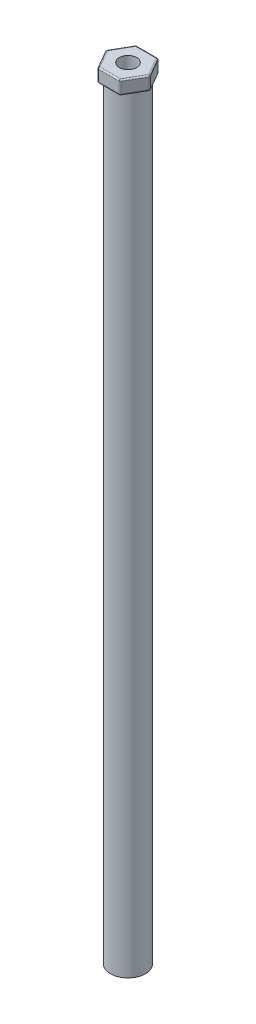
ISO-10303-21;
HEADER;
FILE_DESCRIPTION(('STEP AP214'),'2;1');
FILE_NAME('part.step','',(''),(''),'','','');
FILE_SCHEMA(('AUTOMOTIVE_DESIGN { 1 0 10303 214 1 1 1 1 }'));
ENDSEC;
DATA;
#1=APPLICATION_CONTEXT('core data for automotive mechanical design processes');
#2=APPLICATION_PROTOCOL_DEFINITION('international standard','automotive_design',2000,#1);
#3=PRODUCT_CONTEXT('',#1,'mechanical');
#4=PRODUCT('Part','Part','',(#3));
#5=PRODUCT_RELATED_PRODUCT_CATEGORY('part','',(#4));
#6=PRODUCT_DEFINITION_FORMATION('','',#4);
#7=PRODUCT_DEFINITION_CONTEXT('part definition',#1,'design');
#8=PRODUCT_DEFINITION('design','',#6,#7);
#9=PRODUCT_DEFINITION_SHAPE('','',#8);
#10=(LENGTH_UNIT() NAMED_UNIT(*) SI_UNIT(.MILLI.,.METRE.));
#11=(NAMED_UNIT(*) PLANE_ANGLE_UNIT() SI_UNIT($,.RADIAN.));
#12=(NAMED_UNIT(*) SI_UNIT($,.STERADIAN.) SOLID_ANGLE_UNIT());
#13=UNCERTAINTY_MEASURE_WITH_UNIT(LENGTH_MEASURE(1.E-05),#10,'distance_accuracy_value','');
#14=(GEOMETRIC_REPRESENTATION_CONTEXT(3) GLOBAL_UNCERTAINTY_ASSIGNED_CONTEXT((#13)) GLOBAL_UNIT_ASSIGNED_CONTEXT((#10,
#11,#12)) REPRESENTATION_CONTEXT('',''));
#15=CARTESIAN_POINT('',(0.,0.,0.));
#16=DIRECTION('',(0.,0.,1.));
#17=DIRECTION('',(1.,0.,0.));
#18=AXIS2_PLACEMENT_3D('',#15,#16,#17);
#19=CARTESIAN_POINT('',(0.,0.,0.));
#20=DIRECTION('',(0.,1.,0.));
#21=DIRECTION('',(0.,0.,1.));
#22=AXIS2_PLACEMENT_3D('',#19,#20,#21);
#23=PLANE('',#22);
#24=CARTESIAN_POINT('',(0.,0.,0.));
#25=DIRECTION('',(0.,1.,0.));
#26=DIRECTION('',(0.,0.,1.));
#27=AXIS2_PLACEMENT_3D('',#24,#25,#26);
#28=CIRCLE('',#27,6.35);
#29=CARTESIAN_POINT('',(0.,0.,6.35));
#30=VERTEX_POINT('',#29);
#31=EDGE_CURVE('E286',#30,#30,#28,.T.);
#32=ORIENTED_EDGE('',*,*,#31,.F.);
#33=EDGE_LOOP('',(#32));
#34=FACE_BOUND('',#33,.T.);
#35=CARTESIAN_POINT('',(0.,0.,0.));
#36=DIRECTION('',(0.,1.,0.));
#37=DIRECTION('',(0.,0.,1.));
#38=AXIS2_PLACEMENT_3D('',#35,#36,#37);
#39=CIRCLE('',#38,3.175);
#40=CARTESIAN_POINT('',(0.,0.,3.175));
#41=VERTEX_POINT('',#40);
#42=EDGE_CURVE('E281',#41,#41,#39,.T.);
#43=ORIENTED_EDGE('',*,*,#42,.T.);
#44=EDGE_LOOP('',(#43));
#45=FACE_BOUND('',#44,.T.);
#46=ADVANCED_FACE('F36',(#34,#45),#23,.F.);
#47=CARTESIAN_POINT('',(0.,279.4,0.));
#48=DIRECTION('',(0.,-1.,0.));
#49=DIRECTION('',(0.,0.,-1.));
#50=AXIS2_PLACEMENT_3D('',#47,#48,#49);
#51=CYLINDRICAL_SURFACE('',#50,6.35);
#52=CARTESIAN_POINT('',(0.,279.4,0.));
#53=DIRECTION('',(0.,1.,0.));
#54=DIRECTION('',(0.,0.,1.));
#55=AXIS2_PLACEMENT_3D('',#52,#53,#54);
#56=CIRCLE('',#55,6.35);
#57=CARTESIAN_POINT('',(0.,279.4,6.35));
#58=VERTEX_POINT('',#57);
#59=EDGE_CURVE('E182',#58,#58,#56,.T.);
#60=ORIENTED_EDGE('',*,*,#59,.F.);
#61=EDGE_LOOP('',(#60));
#62=FACE_BOUND('',#61,.T.);
#63=ORIENTED_EDGE('',*,*,#31,.T.);
#64=EDGE_LOOP('',(#63));
#65=FACE_BOUND('',#64,.T.);
#66=ADVANCED_FACE('F442',(#62,#65),#51,.T.);
#67=CARTESIAN_POINT('',(0.,279.4,0.));
#68=DIRECTION('',(0.,-1.,0.));
#69=DIRECTION('',(0.,0.,-1.));
#70=AXIS2_PLACEMENT_3D('',#67,#68,#69);
#71=CYLINDRICAL_SURFACE('',#70,3.175);
#72=ORIENTED_EDGE('',*,*,#42,.F.);
#73=EDGE_LOOP('',(#72));
#74=FACE_BOUND('',#73,.T.);
#75=CARTESIAN_POINT('',(0.,284.4,0.));
#76=DIRECTION('',(0.,1.,0.));
#77=DIRECTION('',(0.,0.,1.));
#78=AXIS2_PLACEMENT_3D('',#75,#76,#77);
#79=CIRCLE('',#78,3.175);
#80=CARTESIAN_POINT('',(0.,284.4,3.175));
#81=VERTEX_POINT('',#80);
#82=EDGE_CURVE('E275',#81,#81,#79,.T.);
#83=ORIENTED_EDGE('',*,*,#82,.T.);
#84=EDGE_LOOP('',(#83));
#85=FACE_BOUND('',#84,.T.);
#86=ADVANCED_FACE('F448',(#74,#85),#71,.F.);
#87=CARTESIAN_POINT('',(0.,284.4,0.));
#88=DIRECTION('',(0.,1.,0.));
#89=DIRECTION('',(0.,0.,1.));
#90=AXIS2_PLACEMENT_3D('',#87,#88,#89);
#91=PLANE('',#90);
#92=DIRECTION('',(1.,0.,0.));
#93=VECTOR('',#92,1.);
#94=CARTESIAN_POINT('',(4.03279163028954,284.4,6.485));
#95=LINE('',#94,#93);
#96=CARTESIAN_POINT('',(-3.74411649569472,284.4,6.485));
#97=VERTEX_POINT('',#96);
#98=CARTESIAN_POINT('',(3.74411649569473,284.4,6.485));
#99=VERTEX_POINT('',#98);
#100=EDGE_CURVE('E351',#97,#99,#95,.T.);
#101=ORIENTED_EDGE('',*,*,#100,.T.);
#102=DIRECTION('',(0.5,0.,-0.866025403784439));
#103=VECTOR('',#102,1.);
#104=CARTESIAN_POINT('',(7.63257055868686,284.4,-0.250000000000001));
#105=LINE('',#104,#103);
#106=CARTESIAN_POINT('',(7.48823299138945,284.4,0.));
#107=VERTEX_POINT('',#106);
#108=EDGE_CURVE('E11',#99,#107,#105,.T.);
#109=ORIENTED_EDGE('',*,*,#108,.T.);
#110=DIRECTION('',(-0.5,0.,-0.866025403784439));
#111=VECTOR('',#110,1.);
#112=CARTESIAN_POINT('',(3.59977892839731,284.4,-6.73500000000001));
#113=LINE('',#112,#111);
#114=CARTESIAN_POINT('',(3.74411649569472,284.4,-6.485));
#115=VERTEX_POINT('',#114);
#116=EDGE_CURVE('E45',#107,#115,#113,.T.);
#117=ORIENTED_EDGE('',*,*,#116,.T.);
#118=DIRECTION('',(-1.,0.,0.));
#119=VECTOR('',#118,1.);
#120=CARTESIAN_POINT('',(-4.03279163028953,284.4,-6.485));
#121=LINE('',#120,#119);
#122=CARTESIAN_POINT('',(-3.74411649569472,284.4,-6.485));
#123=VERTEX_POINT('',#122);
#124=EDGE_CURVE('E357',#115,#123,#121,.T.);
#125=ORIENTED_EDGE('',*,*,#124,.T.);
#126=DIRECTION('',(-0.5,0.,0.866025403784439));
#127=VECTOR('',#126,1.);
#128=CARTESIAN_POINT('',(-7.63257055868686,284.4,0.250000000000005));
#129=LINE('',#128,#127);
#130=CARTESIAN_POINT('',(-7.48823299138945,284.4,0.));
#131=VERTEX_POINT('',#130);
#132=EDGE_CURVE('E355',#123,#131,#129,.T.);
#133=ORIENTED_EDGE('',*,*,#132,.T.);
#134=DIRECTION('',(0.5,0.,0.866025403784438));
#135=VECTOR('',#134,1.);
#136=CARTESIAN_POINT('',(-3.59977892839732,284.4,6.735));
#137=LINE('',#136,#135);
#138=EDGE_CURVE('E353',#131,#97,#137,.T.);
#139=ORIENTED_EDGE('',*,*,#138,.T.);
#140=EDGE_LOOP('',(#101,#109,#117,#125,#133,#139));
#141=FACE_BOUND('',#140,.T.);
#142=ORIENTED_EDGE('',*,*,#82,.F.);
#143=EDGE_LOOP('',(#142));
#144=FACE_BOUND('',#143,.T.);
#145=ADVANCED_FACE('F407',(#141,#144),#91,.T.);
#146=CARTESIAN_POINT('',(0.,279.4,0.));
#147=DIRECTION('',(0.,1.,0.));
#148=DIRECTION('',(0.,0.,1.));
#149=AXIS2_PLACEMENT_3D('',#146,#147,#148);
#150=PLANE('',#149);
#151=DIRECTION('',(-0.5,0.,0.866025403784439));
#152=VECTOR('',#151,1.);
#153=CARTESIAN_POINT('',(-5.61617474354209,279.4,-3.2425));
#154=LINE('',#153,#152);
#155=CARTESIAN_POINT('',(-7.48823299138945,279.4,0.));
#156=VERTEX_POINT('',#155);
#157=CARTESIAN_POINT('',(-3.74411649569472,279.4,-6.485));
#158=VERTEX_POINT('',#157);
#159=EDGE_CURVE('E301',#156,#158,#154,.F.);
#160=ORIENTED_EDGE('',*,*,#159,.T.);
#161=DIRECTION('',(-1.,0.,0.));
#162=VECTOR('',#161,1.);
#163=CARTESIAN_POINT('',(0.,279.4,-6.485));
#164=LINE('',#163,#162);
#165=CARTESIAN_POINT('',(3.74411649569472,279.4,-6.485));
#166=VERTEX_POINT('',#165);
#167=EDGE_CURVE('E305',#158,#166,#164,.F.);
#168=ORIENTED_EDGE('',*,*,#167,.T.);
#169=DIRECTION('',(-0.5,0.,-0.866025403784439));
#170=VECTOR('',#169,1.);
#171=CARTESIAN_POINT('',(5.61617474354209,279.4,-3.2425));
#172=LINE('',#171,#170);
#173=CARTESIAN_POINT('',(7.48823299138945,279.4,0.));
#174=VERTEX_POINT('',#173);
#175=EDGE_CURVE('E303',#166,#174,#172,.F.);
#176=ORIENTED_EDGE('',*,*,#175,.T.);
#177=DIRECTION('',(0.5,0.,-0.866025403784439));
#178=VECTOR('',#177,1.);
#179=CARTESIAN_POINT('',(5.61617474354209,279.4,3.2425));
#180=LINE('',#179,#178);
#181=CARTESIAN_POINT('',(3.74411649569472,279.4,6.485));
#182=VERTEX_POINT('',#181);
#183=EDGE_CURVE('E295',#174,#182,#180,.F.);
#184=ORIENTED_EDGE('',*,*,#183,.T.);
#185=DIRECTION('',(1.,0.,0.));
#186=VECTOR('',#185,1.);
#187=CARTESIAN_POINT('',(0.,279.4,6.485));
#188=LINE('',#187,#186);
#189=CARTESIAN_POINT('',(-3.74411649569472,279.4,6.485));
#190=VERTEX_POINT('',#189);
#191=EDGE_CURVE('E297',#182,#190,#188,.F.);
#192=ORIENTED_EDGE('',*,*,#191,.T.);
#193=DIRECTION('',(0.5,0.,0.866025403784438));
#194=VECTOR('',#193,1.);
#195=CARTESIAN_POINT('',(-5.61617474354208,279.4,3.2425));
#196=LINE('',#195,#194);
#197=EDGE_CURVE('E299',#190,#156,#196,.F.);
#198=ORIENTED_EDGE('',*,*,#197,.T.);
#199=EDGE_LOOP('',(#160,#168,#176,#184,#192,#198));
#200=FACE_BOUND('',#199,.T.);
#201=ORIENTED_EDGE('',*,*,#59,.T.);
#202=EDGE_LOOP('',(#201));
#203=FACE_BOUND('',#202,.T.);
#204=ADVANCED_FACE('F385',(#200,#203),#150,.F.);
#205=CARTESIAN_POINT('',(-4.03279163028953,284.4,-6.985));
#206=DIRECTION('',(0.866025403784439,0.,0.5));
#207=DIRECTION('',(0.5,0.,-0.866025403784439));
#208=AXIS2_PLACEMENT_3D('',#205,#206,#207);
#209=PLANE('',#208);
#210=DIRECTION('',(-0.5,0.,0.866025403784439));
#211=VECTOR('',#210,1.);
#212=CARTESIAN_POINT('',(-4.03279163028953,283.9,-6.985));
#213=LINE('',#212,#211);
#214=CARTESIAN_POINT('',(-7.92124569328167,283.9,-0.249999999999997));
#215=VERTEX_POINT('',#214);
#216=CARTESIAN_POINT('',(-4.17712919758694,283.9,-6.735));
#217=VERTEX_POINT('',#216);
#218=EDGE_CURVE('E326',#215,#217,#213,.F.);
#219=ORIENTED_EDGE('',*,*,#218,.T.);
#220=DIRECTION('',(0.,-1.,0.));
#221=VECTOR('',#220,1.);
#222=CARTESIAN_POINT('',(-4.17712919758694,284.4,-6.735));
#223=LINE('',#222,#221);
#224=CARTESIAN_POINT('',(-4.17712919758694,279.9,-6.735));
#225=VERTEX_POINT('',#224);
#226=EDGE_CURVE('E194',#217,#225,#223,.T.);
#227=ORIENTED_EDGE('',*,*,#226,.T.);
#228=DIRECTION('',(-0.5,0.,0.866025403784439));
#229=VECTOR('',#228,1.);
#230=CARTESIAN_POINT('',(-4.03279163028953,279.9,-6.985));
#231=LINE('',#230,#229);
#232=CARTESIAN_POINT('',(-7.92124569328167,279.9,-0.249999999999997));
#233=VERTEX_POINT('',#232);
#234=EDGE_CURVE('E330',#225,#233,#231,.T.);
#235=ORIENTED_EDGE('',*,*,#234,.T.);
#236=DIRECTION('',(0.,-1.,0.));
#237=VECTOR('',#236,1.);
#238=CARTESIAN_POINT('',(-7.92124569328167,284.4,-0.249999999999998));
#239=LINE('',#238,#237);
#240=EDGE_CURVE('E328',#233,#215,#239,.F.);
#241=ORIENTED_EDGE('',*,*,#240,.T.);
#242=EDGE_LOOP('',(#219,#227,#235,#241));
#243=FACE_BOUND('',#242,.T.);
#244=ADVANCED_FACE('F400',(#243),#209,.F.);
#245=CARTESIAN_POINT('',(-8.06558326057907,284.4,0.));
#246=DIRECTION('',(0.866025403784438,0.,-0.5));
#247=DIRECTION('',(-0.5,0.,-0.866025403784438));
#248=AXIS2_PLACEMENT_3D('',#245,#246,#247);
#249=PLANE('',#248);
#250=DIRECTION('',(0.5,0.,0.866025403784438));
#251=VECTOR('',#250,1.);
#252=CARTESIAN_POINT('',(-8.06558326057907,283.9,0.));
#253=LINE('',#252,#251);
#254=CARTESIAN_POINT('',(-4.17712919758694,283.9,6.735));
#255=VERTEX_POINT('',#254);
#256=CARTESIAN_POINT('',(-7.92124569328167,283.9,0.250000000000003));
#257=VERTEX_POINT('',#256);
#258=EDGE_CURVE('E333',#255,#257,#253,.F.);
#259=ORIENTED_EDGE('',*,*,#258,.T.);
#260=DIRECTION('',(0.,-1.,0.));
#261=VECTOR('',#260,1.);
#262=CARTESIAN_POINT('',(-7.92124569328167,284.4,0.250000000000003));
#263=LINE('',#262,#261);
#264=CARTESIAN_POINT('',(-7.92124569328167,279.9,0.250000000000003));
#265=VERTEX_POINT('',#264);
#266=EDGE_CURVE('E339',#257,#265,#263,.T.);
#267=ORIENTED_EDGE('',*,*,#266,.T.);
#268=DIRECTION('',(0.5,0.,0.866025403784438));
#269=VECTOR('',#268,1.);
#270=CARTESIAN_POINT('',(-8.06558326057907,279.9,0.));
#271=LINE('',#270,#269);
#272=CARTESIAN_POINT('',(-4.17712919758694,279.9,6.735));
#273=VERTEX_POINT('',#272);
#274=EDGE_CURVE('E337',#265,#273,#271,.T.);
#275=ORIENTED_EDGE('',*,*,#274,.T.);
#276=DIRECTION('',(0.,-1.,0.));
#277=VECTOR('',#276,1.);
#278=CARTESIAN_POINT('',(-4.17712919758694,284.4,6.735));
#279=LINE('',#278,#277);
#280=EDGE_CURVE('E335',#273,#255,#279,.F.);
#281=ORIENTED_EDGE('',*,*,#280,.T.);
#282=EDGE_LOOP('',(#259,#267,#275,#281));
#283=FACE_BOUND('',#282,.T.);
#284=ADVANCED_FACE('F423',(#283),#249,.F.);
#285=CARTESIAN_POINT('',(-4.03279163028953,284.4,6.985));
#286=DIRECTION('',(0.,0.,-1.));
#287=DIRECTION('',(-1.,0.,0.));
#288=AXIS2_PLACEMENT_3D('',#285,#286,#287);
#289=PLANE('',#288);
#290=DIRECTION('',(1.,0.,0.));
#291=VECTOR('',#290,1.);
#292=CARTESIAN_POINT('',(-4.03279163028953,283.9,6.985));
#293=LINE('',#292,#291);
#294=CARTESIAN_POINT('',(3.74411649569472,283.9,6.985));
#295=VERTEX_POINT('',#294);
#296=CARTESIAN_POINT('',(-3.74411649569472,283.9,6.985));
#297=VERTEX_POINT('',#296);
#298=EDGE_CURVE('E342',#295,#297,#293,.F.);
#299=ORIENTED_EDGE('',*,*,#298,.T.);
#300=DIRECTION('',(0.,-1.,0.));
#301=VECTOR('',#300,1.);
#302=CARTESIAN_POINT('',(-3.74411649569472,284.4,6.985));
#303=LINE('',#302,#301);
#304=CARTESIAN_POINT('',(-3.74411649569472,279.9,6.985));
#305=VERTEX_POINT('',#304);
#306=EDGE_CURVE('E348',#297,#305,#303,.T.);
#307=ORIENTED_EDGE('',*,*,#306,.T.);
#308=DIRECTION('',(1.,0.,0.));
#309=VECTOR('',#308,1.);
#310=CARTESIAN_POINT('',(-4.03279163028953,279.9,6.985));
#311=LINE('',#310,#309);
#312=CARTESIAN_POINT('',(3.74411649569472,279.9,6.985));
#313=VERTEX_POINT('',#312);
#314=EDGE_CURVE('E346',#305,#313,#311,.T.);
#315=ORIENTED_EDGE('',*,*,#314,.T.);
#316=DIRECTION('',(0.,-1.,0.));
#317=VECTOR('',#316,1.);
#318=CARTESIAN_POINT('',(3.74411649569472,284.4,6.985));
#319=LINE('',#318,#317);
#320=EDGE_CURVE('E344',#313,#295,#319,.F.);
#321=ORIENTED_EDGE('',*,*,#320,.T.);
#322=EDGE_LOOP('',(#299,#307,#315,#321));
#323=FACE_BOUND('',#322,.T.);
#324=ADVANCED_FACE('F554',(#323),#289,.F.);
#325=CARTESIAN_POINT('',(4.03279163028954,284.4,6.985));
#326=DIRECTION('',(-0.866025403784439,0.,-0.5));
#327=DIRECTION('',(-0.5,0.,0.866025403784439));
#328=AXIS2_PLACEMENT_3D('',#325,#326,#327);
#329=PLANE('',#328);
#330=DIRECTION('',(0.5,0.,-0.866025403784439));
#331=VECTOR('',#330,1.);
#332=CARTESIAN_POINT('',(4.03279163028954,279.9,6.985));
#333=LINE('',#332,#331);
#334=CARTESIAN_POINT('',(4.17712919758694,279.9,6.735));
#335=VERTEX_POINT('',#334);
#336=CARTESIAN_POINT('',(7.92124569328167,279.9,0.25));
#337=VERTEX_POINT('',#336);
#338=EDGE_CURVE('E321',#335,#337,#333,.T.);
#339=ORIENTED_EDGE('',*,*,#338,.T.);
#340=DIRECTION('',(0.,-1.,0.));
#341=VECTOR('',#340,1.);
#342=CARTESIAN_POINT('',(7.92124569328167,284.4,0.249999999999999));
#343=LINE('',#342,#341);
#344=CARTESIAN_POINT('',(7.92124569328167,283.9,0.25));
#345=VERTEX_POINT('',#344);
#346=EDGE_CURVE('E323',#337,#345,#343,.F.);
#347=ORIENTED_EDGE('',*,*,#346,.T.);
#348=DIRECTION('',(0.5,0.,-0.866025403784439));
#349=VECTOR('',#348,1.);
#350=CARTESIAN_POINT('',(4.03279163028954,283.9,6.985));
#351=LINE('',#350,#349);
#352=CARTESIAN_POINT('',(4.17712919758694,283.9,6.735));
#353=VERTEX_POINT('',#352);
#354=EDGE_CURVE('E317',#345,#353,#351,.F.);
#355=ORIENTED_EDGE('',*,*,#354,.T.);
#356=DIRECTION('',(0.,-1.,0.));
#357=VECTOR('',#356,1.);
#358=CARTESIAN_POINT('',(4.17712919758694,284.4,6.735));
#359=LINE('',#358,#357);
#360=EDGE_CURVE('E319',#353,#335,#359,.T.);
#361=ORIENTED_EDGE('',*,*,#360,.T.);
#362=EDGE_LOOP('',(#339,#347,#355,#361));
#363=FACE_BOUND('',#362,.T.);
#364=ADVANCED_FACE('F541',(#363),#329,.F.);
#365=CARTESIAN_POINT('',(8.06558326057907,284.4,0.));
#366=DIRECTION('',(-0.866025403784439,0.,0.5));
#367=DIRECTION('',(0.5,0.,0.866025403784439));
#368=AXIS2_PLACEMENT_3D('',#365,#366,#367);
#369=PLANE('',#368);
#370=DIRECTION('',(0.,-1.,0.));
#371=VECTOR('',#370,1.);
#372=CARTESIAN_POINT('',(7.92124569328167,284.4,-0.250000000000001));
#373=LINE('',#372,#371);
#374=CARTESIAN_POINT('',(7.92124569328167,283.9,-0.250000000000001));
#375=VERTEX_POINT('',#374);
#376=CARTESIAN_POINT('',(7.92124569328167,279.9,-0.250000000000001));
#377=VERTEX_POINT('',#376);
#378=EDGE_CURVE('E310',#375,#377,#373,.T.);
#379=ORIENTED_EDGE('',*,*,#378,.T.);
#380=DIRECTION('',(-0.5,0.,-0.866025403784439));
#381=VECTOR('',#380,1.);
#382=CARTESIAN_POINT('',(8.06558326057907,279.9,0.));
#383=LINE('',#382,#381);
#384=CARTESIAN_POINT('',(4.17712919758694,279.9,-6.735));
#385=VERTEX_POINT('',#384);
#386=EDGE_CURVE('E314',#377,#385,#383,.T.);
#387=ORIENTED_EDGE('',*,*,#386,.T.);
#388=DIRECTION('',(0.,-1.,0.));
#389=VECTOR('',#388,1.);
#390=CARTESIAN_POINT('',(4.17712919758694,284.4,-6.735));
#391=LINE('',#390,#389);
#392=CARTESIAN_POINT('',(4.17712919758694,283.9,-6.735));
#393=VERTEX_POINT('',#392);
#394=EDGE_CURVE('E312',#385,#393,#391,.F.);
#395=ORIENTED_EDGE('',*,*,#394,.T.);
#396=DIRECTION('',(-0.5,0.,-0.866025403784439));
#397=VECTOR('',#396,1.);
#398=CARTESIAN_POINT('',(8.06558326057907,283.9,0.));
#399=LINE('',#398,#397);
#400=EDGE_CURVE('E308',#393,#375,#399,.F.);
#401=ORIENTED_EDGE('',*,*,#400,.T.);
#402=EDGE_LOOP('',(#379,#387,#395,#401));
#403=FACE_BOUND('',#402,.T.);
#404=ADVANCED_FACE('F549',(#403),#369,.F.);
#405=CARTESIAN_POINT('',(4.03279163028953,284.4,-6.985));
#406=DIRECTION('',(0.,0.,1.));
#407=DIRECTION('',(1.,0.,0.));
#408=AXIS2_PLACEMENT_3D('',#405,#406,#407);
#409=PLANE('',#408);
#410=DIRECTION('',(0.,-1.,0.));
#411=VECTOR('',#410,1.);
#412=CARTESIAN_POINT('',(3.74411649569472,284.4,-6.985));
#413=LINE('',#412,#411);
#414=CARTESIAN_POINT('',(3.74411649569472,283.9,-6.985));
#415=VERTEX_POINT('',#414);
#416=CARTESIAN_POINT('',(3.74411649569472,279.9,-6.985));
#417=VERTEX_POINT('',#416);
#418=EDGE_CURVE('E171',#415,#417,#413,.T.);
#419=ORIENTED_EDGE('',*,*,#418,.T.);
#420=DIRECTION('',(-1.,0.,0.));
#421=VECTOR('',#420,1.);
#422=CARTESIAN_POINT('',(4.03279163028953,279.9,-6.985));
#423=LINE('',#422,#421);
#424=CARTESIAN_POINT('',(-3.74411649569472,279.9,-6.985));
#425=VERTEX_POINT('',#424);
#426=EDGE_CURVE('E167',#417,#425,#423,.T.);
#427=ORIENTED_EDGE('',*,*,#426,.T.);
#428=DIRECTION('',(0.,-1.,0.));
#429=VECTOR('',#428,1.);
#430=CARTESIAN_POINT('',(-3.74411649569472,284.4,-6.985));
#431=LINE('',#430,#429);
#432=CARTESIAN_POINT('',(-3.74411649569472,283.9,-6.985));
#433=VERTEX_POINT('',#432);
#434=EDGE_CURVE('E161',#425,#433,#431,.F.);
#435=ORIENTED_EDGE('',*,*,#434,.T.);
#436=DIRECTION('',(-1.,0.,0.));
#437=VECTOR('',#436,1.);
#438=CARTESIAN_POINT('',(4.03279163028953,283.9,-6.985));
#439=LINE('',#438,#437);
#440=EDGE_CURVE('E164',#433,#415,#439,.F.);
#441=ORIENTED_EDGE('',*,*,#440,.T.);
#442=EDGE_LOOP('',(#419,#427,#435,#441));
#443=FACE_BOUND('',#442,.T.);
#444=ADVANCED_FACE('F163',(#443),#409,.F.);
#445=CARTESIAN_POINT('',(0.,283.9,6.485));
#446=DIRECTION('',(-1.,0.,0.));
#447=DIRECTION('',(0.,0.,1.));
#448=AXIS2_PLACEMENT_3D('',#445,#446,#447);
#449=CYLINDRICAL_SURFACE('',#448,0.5);
#450=CARTESIAN_POINT('',(3.74411649569473,283.9,6.485));
#451=DIRECTION('',(1.,0.,0.));
#452=DIRECTION('',(0.,0.,-1.));
#453=AXIS2_PLACEMENT_3D('',#450,#451,#452);
#454=CIRCLE('',#453,0.5);
#455=EDGE_CURVE('E40',#99,#295,#454,.T.);
#456=ORIENTED_EDGE('',*,*,#455,.F.);
#457=ORIENTED_EDGE('',*,*,#100,.F.);
#458=CARTESIAN_POINT('',(-3.74411649569472,283.9,6.485));
#459=DIRECTION('',(-1.,0.,0.));
#460=DIRECTION('',(0.,-1.,0.));
#461=AXIS2_PLACEMENT_3D('',#458,#459,#460);
#462=CIRCLE('',#461,0.5);
#463=EDGE_CURVE('E268',#297,#97,#462,.T.);
#464=ORIENTED_EDGE('',*,*,#463,.F.);
#465=ORIENTED_EDGE('',*,*,#298,.F.);
#466=EDGE_LOOP('',(#456,#457,#464,#465));
#467=FACE_BOUND('',#466,.T.);
#468=ADVANCED_FACE('F38',(#467),#449,.T.);
#469=CARTESIAN_POINT('',(3.74411649569472,283.9,6.485));
#470=DIRECTION('',(0.,1.,0.));
#471=DIRECTION('',(-1.,0.,0.));
#472=AXIS2_PLACEMENT_3D('',#469,#470,#471);
#473=SPHERICAL_SURFACE('',#472,0.5);
#474=CARTESIAN_POINT('',(3.74411649569472,283.9,6.485));
#475=DIRECTION('',(-0.500000000000001,0.,0.866025403784438));
#476=DIRECTION('',(0.866025403784438,0.,0.500000000000001));
#477=AXIS2_PLACEMENT_3D('',#474,#475,#476);
#478=CIRCLE('',#477,0.5);
#479=EDGE_CURVE('E263',#99,#353,#478,.F.);
#480=ORIENTED_EDGE('',*,*,#479,.F.);
#481=ORIENTED_EDGE('',*,*,#455,.T.);
#482=CARTESIAN_POINT('',(3.74411649569472,283.9,6.485));
#483=DIRECTION('',(0.,1.,0.));
#484=DIRECTION('',(0.,0.,1.));
#485=AXIS2_PLACEMENT_3D('',#482,#483,#484);
#486=CIRCLE('',#485,0.5);
#487=EDGE_CURVE('E266',#353,#295,#486,.F.);
#488=ORIENTED_EDGE('',*,*,#487,.F.);
#489=EDGE_LOOP('',(#480,#481,#488));
#490=FACE_BOUND('',#489,.T.);
#491=ADVANCED_FACE('F432',(#490),#473,.T.);
#492=CARTESIAN_POINT('',(-3.74411649569472,283.9,6.485));
#493=DIRECTION('',(0.,1.,0.));
#494=DIRECTION('',(-1.,0.,0.));
#495=AXIS2_PLACEMENT_3D('',#492,#493,#494);
#496=SPHERICAL_SURFACE('',#495,0.5);
#497=CARTESIAN_POINT('',(-3.74411649569472,283.9,6.485));
#498=DIRECTION('',(0.,1.,0.));
#499=DIRECTION('',(0.,0.,1.));
#500=AXIS2_PLACEMENT_3D('',#497,#498,#499);
#501=CIRCLE('',#500,0.5);
#502=EDGE_CURVE('E257',#297,#255,#501,.F.);
#503=ORIENTED_EDGE('',*,*,#502,.F.);
#504=ORIENTED_EDGE('',*,*,#463,.T.);
#505=CARTESIAN_POINT('',(-3.74411649569472,283.9,6.485));
#506=DIRECTION('',(0.5,0.,0.866025403784439));
#507=DIRECTION('',(0.866025403784439,0.,-0.5));
#508=AXIS2_PLACEMENT_3D('',#505,#506,#507);
#509=CIRCLE('',#508,0.5);
#510=EDGE_CURVE('E260',#255,#97,#509,.F.);
#511=ORIENTED_EDGE('',*,*,#510,.F.);
#512=EDGE_LOOP('',(#503,#504,#511));
#513=FACE_BOUND('',#512,.T.);
#514=ADVANCED_FACE('F429',(#513),#496,.T.);
#515=CARTESIAN_POINT('',(3.74411649569472,284.4,6.485));
#516=DIRECTION('',(0.,-1.,0.));
#517=DIRECTION('',(0.,0.,-1.));
#518=AXIS2_PLACEMENT_3D('',#515,#516,#517);
#519=CYLINDRICAL_SURFACE('',#518,0.5);
#520=ORIENTED_EDGE('',*,*,#487,.T.);
#521=ORIENTED_EDGE('',*,*,#320,.F.);
#522=CARTESIAN_POINT('',(3.74411649569472,279.9,6.485));
#523=DIRECTION('',(0.,-1.,0.));
#524=DIRECTION('',(0.,0.,-1.));
#525=AXIS2_PLACEMENT_3D('',#522,#523,#524);
#526=CIRCLE('',#525,0.5);
#527=EDGE_CURVE('E251',#335,#313,#526,.T.);
#528=ORIENTED_EDGE('',*,*,#527,.F.);
#529=ORIENTED_EDGE('',*,*,#360,.F.);
#530=EDGE_LOOP('',(#520,#521,#528,#529));
#531=FACE_BOUND('',#530,.T.);
#532=ADVANCED_FACE('F431',(#531),#519,.T.);
#533=CARTESIAN_POINT('',(5.61617474354209,283.9,3.2425));
#534=DIRECTION('',(-0.5,0.,0.866025403784439));
#535=DIRECTION('',(0.866025403784439,0.,0.5));
#536=AXIS2_PLACEMENT_3D('',#533,#534,#535);
#537=CYLINDRICAL_SURFACE('',#536,0.5);
#538=ORIENTED_EDGE('',*,*,#479,.T.);
#539=ORIENTED_EDGE('',*,*,#354,.F.);
#540=CARTESIAN_POINT('',(7.48823299138945,283.9,0.));
#541=DIRECTION('',(0.499999999999999,0.,-0.866025403784439));
#542=DIRECTION('',(-0.866025403784439,0.,-0.499999999999999));
#543=AXIS2_PLACEMENT_3D('',#540,#541,#542);
#544=CIRCLE('',#543,0.5);
#545=EDGE_CURVE('E248',#107,#345,#544,.T.);
#546=ORIENTED_EDGE('',*,*,#545,.F.);
#547=ORIENTED_EDGE('',*,*,#108,.F.);
#548=EDGE_LOOP('',(#538,#539,#546,#547));
#549=FACE_BOUND('',#548,.T.);
#550=ADVANCED_FACE('F438',(#549),#537,.T.);
#551=CARTESIAN_POINT('',(-5.61617474354208,283.9,3.2425));
#552=DIRECTION('',(-0.5,0.,-0.866025403784438));
#553=DIRECTION('',(-0.866025403784438,0.,0.5));
#554=AXIS2_PLACEMENT_3D('',#551,#552,#553);
#555=CYLINDRICAL_SURFACE('',#554,0.5);
#556=ORIENTED_EDGE('',*,*,#510,.T.);
#557=ORIENTED_EDGE('',*,*,#138,.F.);
#558=CARTESIAN_POINT('',(-7.48823299138945,283.9,0.));
#559=DIRECTION('',(-0.5,0.,-0.866025403784439));
#560=DIRECTION('',(-0.866025403784439,0.,0.5));
#561=AXIS2_PLACEMENT_3D('',#558,#559,#560);
#562=CIRCLE('',#561,0.5);
#563=EDGE_CURVE('E245',#257,#131,#562,.T.);
#564=ORIENTED_EDGE('',*,*,#563,.F.);
#565=ORIENTED_EDGE('',*,*,#258,.F.);
#566=EDGE_LOOP('',(#556,#557,#564,#565));
#567=FACE_BOUND('',#566,.T.);
#568=ADVANCED_FACE('F412',(#567),#555,.T.);
#569=CARTESIAN_POINT('',(-3.74411649569472,284.4,6.485));
#570=DIRECTION('',(0.,-1.,0.));
#571=DIRECTION('',(0.,0.,-1.));
#572=AXIS2_PLACEMENT_3D('',#569,#570,#571);
#573=CYLINDRICAL_SURFACE('',#572,0.5);
#574=ORIENTED_EDGE('',*,*,#502,.T.);
#575=ORIENTED_EDGE('',*,*,#280,.F.);
#576=CARTESIAN_POINT('',(-3.74411649569472,279.9,6.485));
#577=DIRECTION('',(0.,-1.,0.));
#578=DIRECTION('',(0.,0.,-1.));
#579=AXIS2_PLACEMENT_3D('',#576,#577,#578);
#580=CIRCLE('',#579,0.5);
#581=EDGE_CURVE('E242',#305,#273,#580,.T.);
#582=ORIENTED_EDGE('',*,*,#581,.F.);
#583=ORIENTED_EDGE('',*,*,#306,.F.);
#584=EDGE_LOOP('',(#574,#575,#582,#583));
#585=FACE_BOUND('',#584,.T.);
#586=ADVANCED_FACE('F428',(#585),#573,.T.);
#587=CARTESIAN_POINT('',(-4.03279163028953,279.9,6.485));
#588=DIRECTION('',(1.,0.,0.));
#589=DIRECTION('',(0.,0.,-1.));
#590=AXIS2_PLACEMENT_3D('',#587,#588,#589);
#591=CYLINDRICAL_SURFACE('',#590,0.5);
#592=CARTESIAN_POINT('',(3.74411649569472,279.9,6.485));
#593=DIRECTION('',(1.,0.,0.));
#594=DIRECTION('',(0.,0.,-1.));
#595=AXIS2_PLACEMENT_3D('',#592,#593,#594);
#596=CIRCLE('',#595,0.5);
#597=EDGE_CURVE('E254',#313,#182,#596,.T.);
#598=ORIENTED_EDGE('',*,*,#597,.F.);
#599=ORIENTED_EDGE('',*,*,#314,.F.);
#600=CARTESIAN_POINT('',(-3.74411649569472,279.9,6.485));
#601=DIRECTION('',(-1.,0.,0.));
#602=DIRECTION('',(0.,0.,1.));
#603=AXIS2_PLACEMENT_3D('',#600,#601,#602);
#604=CIRCLE('',#603,0.5);
#605=EDGE_CURVE('E240',#190,#305,#604,.T.);
#606=ORIENTED_EDGE('',*,*,#605,.F.);
#607=ORIENTED_EDGE('',*,*,#191,.F.);
#608=EDGE_LOOP('',(#598,#599,#606,#607));
#609=FACE_BOUND('',#608,.T.);
#610=ADVANCED_FACE('F520',(#609),#591,.T.);
#611=CARTESIAN_POINT('',(3.74411649569472,279.9,6.485));
#612=DIRECTION('',(0.,-1.,0.));
#613=DIRECTION('',(0.,0.,-1.));
#614=AXIS2_PLACEMENT_3D('',#611,#612,#613);
#615=SPHERICAL_SURFACE('',#614,0.5);
#616=ORIENTED_EDGE('',*,*,#527,.T.);
#617=ORIENTED_EDGE('',*,*,#597,.T.);
#618=CARTESIAN_POINT('',(3.74411649569472,279.9,6.485));
#619=DIRECTION('',(-0.500000000000001,0.,0.866025403784438));
#620=DIRECTION('',(0.866025403784438,0.,0.500000000000001));
#621=AXIS2_PLACEMENT_3D('',#618,#619,#620);
#622=CIRCLE('',#621,0.5);
#623=EDGE_CURVE('E237',#335,#182,#622,.F.);
#624=ORIENTED_EDGE('',*,*,#623,.F.);
#625=EDGE_LOOP('',(#616,#617,#624));
#626=FACE_BOUND('',#625,.T.);
#627=ADVANCED_FACE('F516',(#626),#615,.T.);
#628=CARTESIAN_POINT('',(7.48823299138945,283.9,0.));
#629=DIRECTION('',(0.,1.,0.));
#630=DIRECTION('',(0.,0.,1.));
#631=AXIS2_PLACEMENT_3D('',#628,#629,#630);
#632=SPHERICAL_SURFACE('',#631,0.5);
#633=CARTESIAN_POINT('',(7.48823299138945,283.9,0.));
#634=DIRECTION('',(0.5,0.,0.866025403784439));
#635=DIRECTION('',(0.866025403784439,0.,-0.5));
#636=AXIS2_PLACEMENT_3D('',#633,#634,#635);
#637=CIRCLE('',#636,0.5);
#638=EDGE_CURVE('E233',#107,#375,#637,.F.);
#639=ORIENTED_EDGE('',*,*,#638,.F.);
#640=ORIENTED_EDGE('',*,*,#545,.T.);
#641=CARTESIAN_POINT('',(7.48823299138945,283.9,0.));
#642=DIRECTION('',(0.,1.,0.));
#643=DIRECTION('',(0.,0.,1.));
#644=AXIS2_PLACEMENT_3D('',#641,#642,#643);
#645=CIRCLE('',#644,0.5);
#646=EDGE_CURVE('E235',#375,#345,#645,.F.);
#647=ORIENTED_EDGE('',*,*,#646,.F.);
#648=EDGE_LOOP('',(#639,#640,#647));
#649=FACE_BOUND('',#648,.T.);
#650=ADVANCED_FACE('F513',(#649),#632,.T.);
#651=CARTESIAN_POINT('',(-7.48823299138945,283.9,0.));
#652=DIRECTION('',(0.,1.,0.));
#653=DIRECTION('',(-1.,0.,0.));
#654=AXIS2_PLACEMENT_3D('',#651,#652,#653);
#655=SPHERICAL_SURFACE('',#654,0.5);
#656=CARTESIAN_POINT('',(-7.48823299138945,283.9,0.));
#657=DIRECTION('',(0.,1.,0.));
#658=DIRECTION('',(0.,0.,1.));
#659=AXIS2_PLACEMENT_3D('',#656,#657,#658);
#660=CIRCLE('',#659,0.5);
#661=EDGE_CURVE('E227',#257,#215,#660,.F.);
#662=ORIENTED_EDGE('',*,*,#661,.F.);
#663=ORIENTED_EDGE('',*,*,#563,.T.);
#664=CARTESIAN_POINT('',(-7.48823299138945,283.9,0.));
#665=DIRECTION('',(-0.499999999999998,0.,0.86602540378444));
#666=DIRECTION('',(0.86602540378444,0.,0.499999999999998));
#667=AXIS2_PLACEMENT_3D('',#664,#665,#666);
#668=CIRCLE('',#667,0.5);
#669=EDGE_CURVE('E230',#215,#131,#668,.F.);
#670=ORIENTED_EDGE('',*,*,#669,.F.);
#671=EDGE_LOOP('',(#662,#663,#670));
#672=FACE_BOUND('',#671,.T.);
#673=ADVANCED_FACE('F416',(#672),#655,.T.);
#674=CARTESIAN_POINT('',(-3.74411649569472,279.9,6.485));
#675=DIRECTION('',(0.,-1.,0.));
#676=DIRECTION('',(0.,0.,-1.));
#677=AXIS2_PLACEMENT_3D('',#674,#675,#676);
#678=SPHERICAL_SURFACE('',#677,0.5);
#679=ORIENTED_EDGE('',*,*,#605,.T.);
#680=ORIENTED_EDGE('',*,*,#581,.T.);
#681=CARTESIAN_POINT('',(-3.74411649569472,279.9,6.485));
#682=DIRECTION('',(0.500000000000001,0.,0.866025403784438));
#683=DIRECTION('',(0.866025403784438,0.,-0.500000000000001));
#684=AXIS2_PLACEMENT_3D('',#681,#682,#683);
#685=CIRCLE('',#684,0.5);
#686=EDGE_CURVE('E224',#190,#273,#685,.F.);
#687=ORIENTED_EDGE('',*,*,#686,.F.);
#688=EDGE_LOOP('',(#679,#680,#687));
#689=FACE_BOUND('',#688,.T.);
#690=ADVANCED_FACE('F506',(#689),#678,.T.);
#691=CARTESIAN_POINT('',(3.59977892839732,279.9,6.735));
#692=DIRECTION('',(0.5,0.,-0.866025403784439));
#693=DIRECTION('',(-0.866025403784439,0.,-0.5));
#694=AXIS2_PLACEMENT_3D('',#691,#692,#693);
#695=CYLINDRICAL_SURFACE('',#694,0.5);
#696=ORIENTED_EDGE('',*,*,#623,.T.);
#697=ORIENTED_EDGE('',*,*,#183,.F.);
#698=CARTESIAN_POINT('',(7.48823299138945,279.9,0.));
#699=DIRECTION('',(0.5,0.,-0.866025403784439));
#700=DIRECTION('',(-0.866025403784439,0.,-0.5));
#701=AXIS2_PLACEMENT_3D('',#698,#699,#700);
#702=CIRCLE('',#701,0.5);
#703=EDGE_CURVE('E221',#337,#174,#702,.T.);
#704=ORIENTED_EDGE('',*,*,#703,.F.);
#705=ORIENTED_EDGE('',*,*,#338,.F.);
#706=EDGE_LOOP('',(#696,#697,#704,#705));
#707=FACE_BOUND('',#706,.T.);
#708=ADVANCED_FACE('F502',(#707),#695,.T.);
#709=CARTESIAN_POINT('',(7.48823299138945,284.4,0.));
#710=DIRECTION('',(0.,-1.,0.));
#711=DIRECTION('',(0.,0.,-1.));
#712=AXIS2_PLACEMENT_3D('',#709,#710,#711);
#713=CYLINDRICAL_SURFACE('',#712,0.5);
#714=ORIENTED_EDGE('',*,*,#646,.T.);
#715=ORIENTED_EDGE('',*,*,#346,.F.);
#716=CARTESIAN_POINT('',(7.48823299138945,279.9,0.));
#717=DIRECTION('',(0.,-1.,0.));
#718=DIRECTION('',(0.,0.,-1.));
#719=AXIS2_PLACEMENT_3D('',#716,#717,#718);
#720=CIRCLE('',#719,0.5);
#721=EDGE_CURVE('E218',#377,#337,#720,.T.);
#722=ORIENTED_EDGE('',*,*,#721,.F.);
#723=ORIENTED_EDGE('',*,*,#378,.F.);
#724=EDGE_LOOP('',(#714,#715,#722,#723));
#725=FACE_BOUND('',#724,.T.);
#726=ADVANCED_FACE('F499',(#725),#713,.T.);
#727=CARTESIAN_POINT('',(5.61617474354209,283.9,-3.2425));
#728=DIRECTION('',(0.5,0.,0.866025403784439));
#729=DIRECTION('',(0.866025403784439,0.,-0.5));
#730=AXIS2_PLACEMENT_3D('',#727,#728,#729);
#731=CYLINDRICAL_SURFACE('',#730,0.5);
#732=ORIENTED_EDGE('',*,*,#638,.T.);
#733=ORIENTED_EDGE('',*,*,#400,.F.);
#734=CARTESIAN_POINT('',(3.74411649569472,283.9,-6.485));
#735=DIRECTION('',(-0.5,0.,-0.866025403784439));
#736=DIRECTION('',(-0.866025403784439,0.,0.5));
#737=AXIS2_PLACEMENT_3D('',#734,#735,#736);
#738=CIRCLE('',#737,0.5);
#739=EDGE_CURVE('E215',#115,#393,#738,.T.);
#740=ORIENTED_EDGE('',*,*,#739,.F.);
#741=ORIENTED_EDGE('',*,*,#116,.F.);
#742=EDGE_LOOP('',(#732,#733,#740,#741));
#743=FACE_BOUND('',#742,.T.);
#744=ADVANCED_FACE('F496',(#743),#731,.T.);
#745=CARTESIAN_POINT('',(0.,283.9,-6.485));
#746=DIRECTION('',(1.,0.,0.));
#747=DIRECTION('',(0.,0.,-1.));
#748=AXIS2_PLACEMENT_3D('',#745,#746,#747);
#749=CYLINDRICAL_SURFACE('',#748,0.5);
#750=CARTESIAN_POINT('',(-3.74411649569472,283.9,-6.485));
#751=DIRECTION('',(-1.,0.,0.));
#752=DIRECTION('',(0.,0.,1.));
#753=AXIS2_PLACEMENT_3D('',#750,#751,#752);
#754=CIRCLE('',#753,0.5);
#755=EDGE_CURVE('E177',#123,#433,#754,.T.);
#756=ORIENTED_EDGE('',*,*,#755,.F.);
#757=ORIENTED_EDGE('',*,*,#124,.F.);
#758=CARTESIAN_POINT('',(3.74411649569472,283.9,-6.485));
#759=DIRECTION('',(1.,0.,0.));
#760=DIRECTION('',(0.,1.,0.));
#761=AXIS2_PLACEMENT_3D('',#758,#759,#760);
#762=CIRCLE('',#761,0.5);
#763=EDGE_CURVE('E180',#415,#115,#762,.T.);
#764=ORIENTED_EDGE('',*,*,#763,.F.);
#765=ORIENTED_EDGE('',*,*,#440,.F.);
#766=EDGE_LOOP('',(#756,#757,#764,#765));
#767=FACE_BOUND('',#766,.T.);
#768=ADVANCED_FACE('F176',(#767),#749,.T.);
#769=CARTESIAN_POINT('',(-5.61617474354209,283.9,-3.2425));
#770=DIRECTION('',(0.5,0.,-0.866025403784439));
#771=DIRECTION('',(-0.866025403784439,0.,-0.5));
#772=AXIS2_PLACEMENT_3D('',#769,#770,#771);
#773=CYLINDRICAL_SURFACE('',#772,0.5);
#774=ORIENTED_EDGE('',*,*,#669,.T.);
#775=ORIENTED_EDGE('',*,*,#132,.F.);
#776=CARTESIAN_POINT('',(-3.74411649569472,283.9,-6.485));
#777=DIRECTION('',(0.500000000000001,0.,-0.866025403784438));
#778=DIRECTION('',(-0.866025403784438,0.,-0.500000000000001));
#779=AXIS2_PLACEMENT_3D('',#776,#777,#778);
#780=CIRCLE('',#779,0.5);
#781=EDGE_CURVE('E190',#217,#123,#780,.T.);
#782=ORIENTED_EDGE('',*,*,#781,.F.);
#783=ORIENTED_EDGE('',*,*,#218,.F.);
#784=EDGE_LOOP('',(#774,#775,#782,#783));
#785=FACE_BOUND('',#784,.T.);
#786=ADVANCED_FACE('F404',(#785),#773,.T.);
#787=CARTESIAN_POINT('',(-7.48823299138945,284.4,0.));
#788=DIRECTION('',(0.,-1.,0.));
#789=DIRECTION('',(0.,0.,-1.));
#790=AXIS2_PLACEMENT_3D('',#787,#788,#789);
#791=CYLINDRICAL_SURFACE('',#790,0.5);
#792=ORIENTED_EDGE('',*,*,#661,.T.);
#793=ORIENTED_EDGE('',*,*,#240,.F.);
#794=CARTESIAN_POINT('',(-7.48823299138945,279.9,0.));
#795=DIRECTION('',(0.,-1.,0.));
#796=DIRECTION('',(0.,0.,-1.));
#797=AXIS2_PLACEMENT_3D('',#794,#795,#796);
#798=CIRCLE('',#797,0.5);
#799=EDGE_CURVE('E210',#265,#233,#798,.T.);
#800=ORIENTED_EDGE('',*,*,#799,.F.);
#801=ORIENTED_EDGE('',*,*,#266,.F.);
#802=EDGE_LOOP('',(#792,#793,#800,#801));
#803=FACE_BOUND('',#802,.T.);
#804=ADVANCED_FACE('F420',(#803),#791,.T.);
#805=CARTESIAN_POINT('',(-7.63257055868685,279.9,-0.249999999999997));
#806=DIRECTION('',(0.5,0.,0.866025403784438));
#807=DIRECTION('',(0.866025403784438,0.,-0.5));
#808=AXIS2_PLACEMENT_3D('',#805,#806,#807);
#809=CYLINDRICAL_SURFACE('',#808,0.5);
#810=ORIENTED_EDGE('',*,*,#686,.T.);
#811=ORIENTED_EDGE('',*,*,#274,.F.);
#812=CARTESIAN_POINT('',(-7.48823299138945,279.9,0.));
#813=DIRECTION('',(-0.5,0.,-0.866025403784438));
#814=DIRECTION('',(-0.866025403784438,0.,0.5));
#815=AXIS2_PLACEMENT_3D('',#812,#813,#814);
#816=CIRCLE('',#815,0.5);
#817=EDGE_CURVE('E208',#156,#265,#816,.T.);
#818=ORIENTED_EDGE('',*,*,#817,.F.);
#819=ORIENTED_EDGE('',*,*,#197,.F.);
#820=EDGE_LOOP('',(#810,#811,#818,#819));
#821=FACE_BOUND('',#820,.T.);
#822=ADVANCED_FACE('F485',(#821),#809,.T.);
#823=CARTESIAN_POINT('',(7.48823299138945,279.9,0.));
#824=DIRECTION('',(0.,-1.,0.));
#825=DIRECTION('',(0.,0.,-1.));
#826=AXIS2_PLACEMENT_3D('',#823,#824,#825);
#827=SPHERICAL_SURFACE('',#826,0.5);
#828=ORIENTED_EDGE('',*,*,#721,.T.);
#829=ORIENTED_EDGE('',*,*,#703,.T.);
#830=CARTESIAN_POINT('',(7.48823299138945,279.9,0.));
#831=DIRECTION('',(0.5,0.,0.866025403784439));
#832=DIRECTION('',(0.866025403784439,0.,-0.5));
#833=AXIS2_PLACEMENT_3D('',#830,#831,#832);
#834=CIRCLE('',#833,0.5);
#835=EDGE_CURVE('E199',#377,#174,#834,.F.);
#836=ORIENTED_EDGE('',*,*,#835,.F.);
#837=EDGE_LOOP('',(#828,#829,#836));
#838=FACE_BOUND('',#837,.T.);
#839=ADVANCED_FACE('F481',(#838),#827,.T.);
#840=CARTESIAN_POINT('',(3.74411649569472,283.9,-6.485));
#841=DIRECTION('',(0.,1.,0.));
#842=DIRECTION('',(-1.,0.,0.));
#843=AXIS2_PLACEMENT_3D('',#840,#841,#842);
#844=SPHERICAL_SURFACE('',#843,0.5);
#845=ORIENTED_EDGE('',*,*,#763,.T.);
#846=ORIENTED_EDGE('',*,*,#739,.T.);
#847=CARTESIAN_POINT('',(3.74411649569472,283.9,-6.485));
#848=DIRECTION('',(0.,1.,0.));
#849=DIRECTION('',(0.,0.,1.));
#850=AXIS2_PLACEMENT_3D('',#847,#848,#849);
#851=CIRCLE('',#850,0.5);
#852=EDGE_CURVE('E195',#415,#393,#851,.F.);
#853=ORIENTED_EDGE('',*,*,#852,.F.);
#854=EDGE_LOOP('',(#845,#846,#853));
#855=FACE_BOUND('',#854,.T.);
#856=ADVANCED_FACE('F478',(#855),#844,.T.);
#857=CARTESIAN_POINT('',(-3.74411649569472,283.9,-6.485));
#858=DIRECTION('',(0.,1.,0.));
#859=DIRECTION('',(-1.,0.,0.));
#860=AXIS2_PLACEMENT_3D('',#857,#858,#859);
#861=SPHERICAL_SURFACE('',#860,0.5);
#862=ORIENTED_EDGE('',*,*,#781,.T.);
#863=ORIENTED_EDGE('',*,*,#755,.T.);
#864=CARTESIAN_POINT('',(-3.74411649569472,283.9,-6.485));
#865=DIRECTION('',(0.,1.,0.));
#866=DIRECTION('',(0.,0.,1.));
#867=AXIS2_PLACEMENT_3D('',#864,#865,#866);
#868=CIRCLE('',#867,0.5);
#869=EDGE_CURVE('E187',#217,#433,#868,.F.);
#870=ORIENTED_EDGE('',*,*,#869,.F.);
#871=EDGE_LOOP('',(#862,#863,#870));
#872=FACE_BOUND('',#871,.T.);
#873=ADVANCED_FACE('F186',(#872),#861,.T.);
#874=CARTESIAN_POINT('',(-7.48823299138945,279.9,0.));
#875=DIRECTION('',(0.,-1.,0.));
#876=DIRECTION('',(0.,0.,-1.));
#877=AXIS2_PLACEMENT_3D('',#874,#875,#876);
#878=SPHERICAL_SURFACE('',#877,0.5);
#879=ORIENTED_EDGE('',*,*,#817,.T.);
#880=ORIENTED_EDGE('',*,*,#799,.T.);
#881=CARTESIAN_POINT('',(-7.48823299138945,279.9,0.));
#882=DIRECTION('',(-0.5,0.,0.866025403784439));
#883=DIRECTION('',(0.866025403784439,0.,0.5));
#884=AXIS2_PLACEMENT_3D('',#881,#882,#883);
#885=CIRCLE('',#884,0.5);
#886=EDGE_CURVE('E196',#156,#233,#885,.F.);
#887=ORIENTED_EDGE('',*,*,#886,.F.);
#888=EDGE_LOOP('',(#879,#880,#887));
#889=FACE_BOUND('',#888,.T.);
#890=ADVANCED_FACE('F472',(#889),#878,.T.);
#891=CARTESIAN_POINT('',(7.63257055868685,279.9,0.249999999999999));
#892=DIRECTION('',(-0.5,0.,-0.866025403784439));
#893=DIRECTION('',(-0.866025403784439,0.,0.5));
#894=AXIS2_PLACEMENT_3D('',#891,#892,#893);
#895=CYLINDRICAL_SURFACE('',#894,0.5);
#896=ORIENTED_EDGE('',*,*,#835,.T.);
#897=ORIENTED_EDGE('',*,*,#175,.F.);
#898=CARTESIAN_POINT('',(3.74411649569472,279.9,-6.485));
#899=DIRECTION('',(-0.500000000000001,0.,-0.866025403784438));
#900=DIRECTION('',(-0.866025403784438,0.,0.500000000000001));
#901=AXIS2_PLACEMENT_3D('',#898,#899,#900);
#902=CIRCLE('',#901,0.5);
#903=EDGE_CURVE('E202',#385,#166,#902,.T.);
#904=ORIENTED_EDGE('',*,*,#903,.F.);
#905=ORIENTED_EDGE('',*,*,#386,.F.);
#906=EDGE_LOOP('',(#896,#897,#904,#905));
#907=FACE_BOUND('',#906,.T.);
#908=ADVANCED_FACE('F380',(#907),#895,.T.);
#909=CARTESIAN_POINT('',(3.74411649569472,284.4,-6.485));
#910=DIRECTION('',(0.,-1.,0.));
#911=DIRECTION('',(0.,0.,-1.));
#912=AXIS2_PLACEMENT_3D('',#909,#910,#911);
#913=CYLINDRICAL_SURFACE('',#912,0.5);
#914=ORIENTED_EDGE('',*,*,#852,.T.);
#915=ORIENTED_EDGE('',*,*,#394,.F.);
#916=CARTESIAN_POINT('',(3.74411649569472,279.9,-6.485));
#917=DIRECTION('',(0.,-1.,0.));
#918=DIRECTION('',(0.,0.,-1.));
#919=AXIS2_PLACEMENT_3D('',#916,#917,#918);
#920=CIRCLE('',#919,0.5);
#921=EDGE_CURVE('E369',#417,#385,#920,.T.);
#922=ORIENTED_EDGE('',*,*,#921,.F.);
#923=ORIENTED_EDGE('',*,*,#418,.F.);
#924=EDGE_LOOP('',(#914,#915,#922,#923));
#925=FACE_BOUND('',#924,.T.);
#926=ADVANCED_FACE('F466',(#925),#913,.T.);
#927=CARTESIAN_POINT('',(-3.74411649569472,284.4,-6.485));
#928=DIRECTION('',(0.,-1.,0.));
#929=DIRECTION('',(0.,0.,-1.));
#930=AXIS2_PLACEMENT_3D('',#927,#928,#929);
#931=CYLINDRICAL_SURFACE('',#930,0.5);
#932=ORIENTED_EDGE('',*,*,#869,.T.);
#933=ORIENTED_EDGE('',*,*,#434,.F.);
#934=CARTESIAN_POINT('',(-3.74411649569472,279.9,-6.485));
#935=DIRECTION('',(0.,-1.,0.));
#936=DIRECTION('',(0.,0.,-1.));
#937=AXIS2_PLACEMENT_3D('',#934,#935,#936);
#938=CIRCLE('',#937,0.5);
#939=EDGE_CURVE('E366',#225,#425,#938,.T.);
#940=ORIENTED_EDGE('',*,*,#939,.F.);
#941=ORIENTED_EDGE('',*,*,#226,.F.);
#942=EDGE_LOOP('',(#932,#933,#940,#941));
#943=FACE_BOUND('',#942,.T.);
#944=ADVANCED_FACE('F192',(#943),#931,.T.);
#945=CARTESIAN_POINT('',(-3.59977892839732,279.9,-6.735));
#946=DIRECTION('',(-0.5,0.,0.866025403784439));
#947=DIRECTION('',(0.866025403784439,0.,0.5));
#948=AXIS2_PLACEMENT_3D('',#945,#946,#947);
#949=CYLINDRICAL_SURFACE('',#948,0.5);
#950=ORIENTED_EDGE('',*,*,#886,.T.);
#951=ORIENTED_EDGE('',*,*,#234,.F.);
#952=CARTESIAN_POINT('',(-3.74411649569472,279.9,-6.485));
#953=DIRECTION('',(0.500000000000001,0.,-0.866025403784438));
#954=DIRECTION('',(-0.866025403784438,0.,-0.500000000000001));
#955=AXIS2_PLACEMENT_3D('',#952,#953,#954);
#956=CIRCLE('',#955,0.5);
#957=EDGE_CURVE('E364',#158,#225,#956,.T.);
#958=ORIENTED_EDGE('',*,*,#957,.F.);
#959=ORIENTED_EDGE('',*,*,#159,.F.);
#960=EDGE_LOOP('',(#950,#951,#958,#959));
#961=FACE_BOUND('',#960,.T.);
#962=ADVANCED_FACE('F396',(#961),#949,.T.);
#963=CARTESIAN_POINT('',(3.74411649569472,279.9,-6.485));
#964=DIRECTION('',(0.,-1.,0.));
#965=DIRECTION('',(0.,0.,-1.));
#966=AXIS2_PLACEMENT_3D('',#963,#964,#965);
#967=SPHERICAL_SURFACE('',#966,0.5);
#968=ORIENTED_EDGE('',*,*,#921,.T.);
#969=ORIENTED_EDGE('',*,*,#903,.T.);
#970=CARTESIAN_POINT('',(3.74411649569472,279.9,-6.485));
#971=DIRECTION('',(1.,0.,0.));
#972=DIRECTION('',(0.,0.,-1.));
#973=AXIS2_PLACEMENT_3D('',#970,#971,#972);
#974=CIRCLE('',#973,0.5);
#975=EDGE_CURVE('E362',#417,#166,#974,.F.);
#976=ORIENTED_EDGE('',*,*,#975,.F.);
#977=EDGE_LOOP('',(#968,#969,#976));
#978=FACE_BOUND('',#977,.T.);
#979=ADVANCED_FACE('F375',(#978),#967,.T.);
#980=CARTESIAN_POINT('',(-3.74411649569472,279.9,-6.485));
#981=DIRECTION('',(0.,-1.,0.));
#982=DIRECTION('',(0.,0.,-1.));
#983=AXIS2_PLACEMENT_3D('',#980,#981,#982);
#984=SPHERICAL_SURFACE('',#983,0.5);
#985=ORIENTED_EDGE('',*,*,#957,.T.);
#986=ORIENTED_EDGE('',*,*,#939,.T.);
#987=CARTESIAN_POINT('',(-3.74411649569472,279.9,-6.485));
#988=DIRECTION('',(-1.,0.,0.));
#989=DIRECTION('',(0.,0.,1.));
#990=AXIS2_PLACEMENT_3D('',#987,#988,#989);
#991=CIRCLE('',#990,0.5);
#992=EDGE_CURVE('E360',#158,#425,#991,.F.);
#993=ORIENTED_EDGE('',*,*,#992,.F.);
#994=EDGE_LOOP('',(#985,#986,#993));
#995=FACE_BOUND('',#994,.T.);
#996=ADVANCED_FACE('F393',(#995),#984,.T.);
#997=CARTESIAN_POINT('',(4.03279163028953,279.9,-6.485));
#998=DIRECTION('',(-1.,0.,0.));
#999=DIRECTION('',(0.,0.,1.));
#1000=AXIS2_PLACEMENT_3D('',#997,#998,#999);
#1001=CYLINDRICAL_SURFACE('',#1000,0.5);
#1002=ORIENTED_EDGE('',*,*,#975,.T.);
#1003=ORIENTED_EDGE('',*,*,#167,.F.);
#1004=ORIENTED_EDGE('',*,*,#992,.T.);
#1005=ORIENTED_EDGE('',*,*,#426,.F.);
#1006=EDGE_LOOP('',(#1002,#1003,#1004,#1005));
#1007=FACE_BOUND('',#1006,.T.);
#1008=ADVANCED_FACE('F391',(#1007),#1001,.T.);
#1009=CLOSED_SHELL('',(#46,#66,#86,#145,#204,#244,#284,#324,#364,#404,#444,#468,#491,#514,#532,
#550,#568,#586,#610,#627,#650,#673,#690,#708,#726,#744,#768,#786,#804,#822,#839,#856,#873,#890,
#908,#926,#944,#962,#979,#996,#1008));
#1010=MANIFOLD_SOLID_BREP('B2',#1009);
#1011=ADVANCED_BREP_SHAPE_REPRESENTATION('',(#18,#1010),#14);
#1012=SHAPE_DEFINITION_REPRESENTATION(#9,#1011);
ENDSEC;
END-ISO-10303-21;
